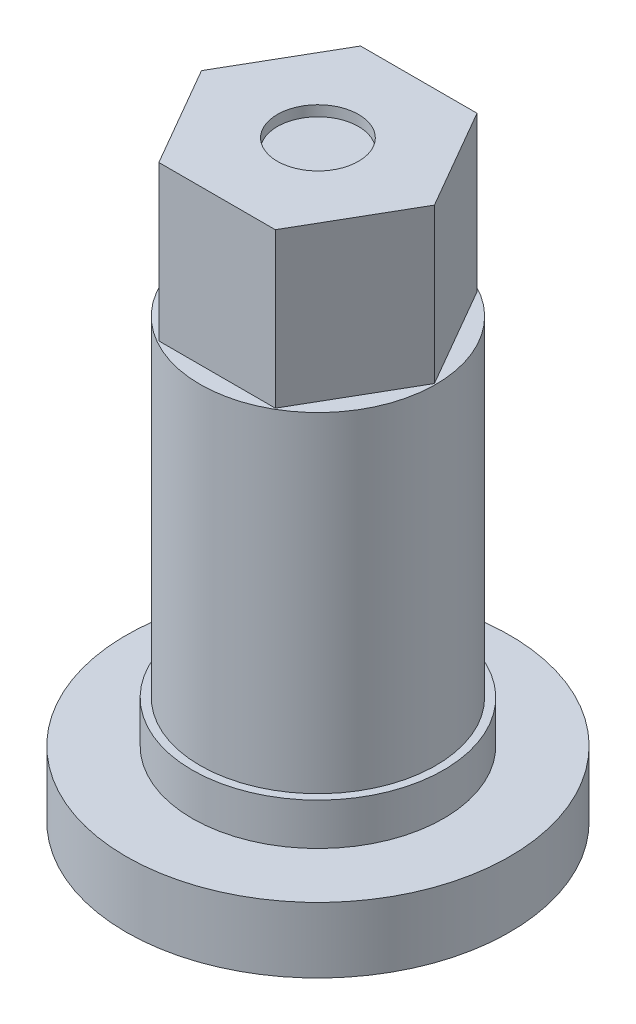
ISO-10303-21;
HEADER;
FILE_DESCRIPTION(('STEP AP214'),'2;1');
FILE_NAME('part.step','',(''),(''),'','','');
FILE_SCHEMA(('AUTOMOTIVE_DESIGN { 1 0 10303 214 1 1 1 1 }'));
ENDSEC;
DATA;
#1=APPLICATION_CONTEXT('core data for automotive mechanical design processes');
#2=APPLICATION_PROTOCOL_DEFINITION('international standard','automotive_design',2000,#1);
#3=PRODUCT_CONTEXT('',#1,'mechanical');
#4=PRODUCT('Part','Part','',(#3));
#5=PRODUCT_RELATED_PRODUCT_CATEGORY('part','',(#4));
#6=PRODUCT_DEFINITION_FORMATION('','',#4);
#7=PRODUCT_DEFINITION_CONTEXT('part definition',#1,'design');
#8=PRODUCT_DEFINITION('design','',#6,#7);
#9=PRODUCT_DEFINITION_SHAPE('','',#8);
#10=(LENGTH_UNIT() NAMED_UNIT(*) SI_UNIT(.MILLI.,.METRE.));
#11=(NAMED_UNIT(*) PLANE_ANGLE_UNIT() SI_UNIT($,.RADIAN.));
#12=(NAMED_UNIT(*) SI_UNIT($,.STERADIAN.) SOLID_ANGLE_UNIT());
#13=UNCERTAINTY_MEASURE_WITH_UNIT(LENGTH_MEASURE(1.E-05),#10,'distance_accuracy_value','');
#14=(GEOMETRIC_REPRESENTATION_CONTEXT(3) GLOBAL_UNCERTAINTY_ASSIGNED_CONTEXT((#13)) GLOBAL_UNIT_ASSIGNED_CONTEXT((#10,
#11,#12)) REPRESENTATION_CONTEXT('',''));
#15=CARTESIAN_POINT('',(0.,0.,0.));
#16=DIRECTION('',(0.,0.,1.));
#17=DIRECTION('',(1.,0.,0.));
#18=AXIS2_PLACEMENT_3D('',#15,#16,#17);
#19=CARTESIAN_POINT('',(0.,1.25,0.));
#20=DIRECTION('',(0.,-1.,0.));
#21=DIRECTION('',(0.,0.,-1.));
#22=AXIS2_PLACEMENT_3D('',#19,#20,#21);
#23=CYLINDRICAL_SURFACE('',#22,3.66);
#24=CARTESIAN_POINT('',(0.,1.25,0.));
#25=DIRECTION('',(0.,1.,0.));
#26=DIRECTION('',(0.,0.,1.));
#27=AXIS2_PLACEMENT_3D('',#24,#25,#26);
#28=CIRCLE('',#27,3.66);
#29=CARTESIAN_POINT('',(0.,1.25,3.66));
#30=VERTEX_POINT('',#29);
#31=EDGE_CURVE('E244',#30,#30,#28,.T.);
#32=ORIENTED_EDGE('',*,*,#31,.F.);
#33=EDGE_LOOP('',(#32));
#34=FACE_BOUND('',#33,.T.);
#35=CARTESIAN_POINT('',(0.,0.,0.));
#36=DIRECTION('',(0.,1.,0.));
#37=DIRECTION('',(0.,0.,1.));
#38=AXIS2_PLACEMENT_3D('',#35,#36,#37);
#39=CIRCLE('',#38,3.66);
#40=CARTESIAN_POINT('',(0.,0.,3.66));
#41=VERTEX_POINT('',#40);
#42=EDGE_CURVE('E44',#41,#41,#39,.T.);
#43=ORIENTED_EDGE('',*,*,#42,.T.);
#44=EDGE_LOOP('',(#43));
#45=FACE_BOUND('',#44,.T.);
#46=ADVANCED_FACE('F45',(#34,#45),#23,.T.);
#47=CARTESIAN_POINT('',(0.,1.25,0.));
#48=DIRECTION('',(0.,1.,0.));
#49=DIRECTION('',(0.,0.,1.));
#50=AXIS2_PLACEMENT_3D('',#47,#48,#49);
#51=PLANE('',#50);
#52=CARTESIAN_POINT('',(0.,1.25,0.));
#53=DIRECTION('',(0.,1.,0.));
#54=DIRECTION('',(0.,0.,1.));
#55=AXIS2_PLACEMENT_3D('',#52,#53,#54);
#56=CIRCLE('',#55,2.4);
#57=CARTESIAN_POINT('',(0.,1.25,2.4));
#58=VERTEX_POINT('',#57);
#59=EDGE_CURVE('E49',#58,#58,#56,.T.);
#60=ORIENTED_EDGE('',*,*,#59,.F.);
#61=EDGE_LOOP('',(#60));
#62=FACE_BOUND('',#61,.T.);
#63=ORIENTED_EDGE('',*,*,#31,.T.);
#64=EDGE_LOOP('',(#63));
#65=FACE_BOUND('',#64,.T.);
#66=ADVANCED_FACE('F257',(#62,#65),#51,.T.);
#67=CARTESIAN_POINT('',(0.,0.,0.));
#68=DIRECTION('',(0.,1.,0.));
#69=DIRECTION('',(0.,0.,1.));
#70=AXIS2_PLACEMENT_3D('',#67,#68,#69);
#71=PLANE('',#70);
#72=DIRECTION('',(0.5,0.,-0.866025403784439));
#73=VECTOR('',#72,1.);
#74=CARTESIAN_POINT('',(-0.95,0.,0.));
#75=LINE('',#74,#73);
#76=CARTESIAN_POINT('',(-0.95,0.,0.));
#77=VERTEX_POINT('',#76);
#78=CARTESIAN_POINT('',(-0.474999999999999,0.,-0.822724133595217));
#79=VERTEX_POINT('',#78);
#80=EDGE_CURVE('E170',#77,#79,#75,.T.);
#81=ORIENTED_EDGE('',*,*,#80,.F.);
#82=DIRECTION('',(-0.500000000000001,0.,-0.866025403784438));
#83=VECTOR('',#82,1.);
#84=CARTESIAN_POINT('',(-0.474999999999999,0.,0.822724133595217));
#85=LINE('',#84,#83);
#86=CARTESIAN_POINT('',(-0.474999999999999,0.,0.822724133595217));
#87=VERTEX_POINT('',#86);
#88=EDGE_CURVE('E59',#87,#77,#85,.T.);
#89=ORIENTED_EDGE('',*,*,#88,.F.);
#90=DIRECTION('',(-1.,0.,0.));
#91=VECTOR('',#90,1.);
#92=CARTESIAN_POINT('',(0.475000000000002,0.,0.822724133595216));
#93=LINE('',#92,#91);
#94=CARTESIAN_POINT('',(0.475000000000002,0.,0.822724133595216));
#95=VERTEX_POINT('',#94);
#96=EDGE_CURVE('E152',#95,#87,#93,.T.);
#97=ORIENTED_EDGE('',*,*,#96,.F.);
#98=DIRECTION('',(-0.499999999999999,0.,0.866025403784439));
#99=VECTOR('',#98,1.);
#100=CARTESIAN_POINT('',(0.95,0.,0.));
#101=LINE('',#100,#99);
#102=CARTESIAN_POINT('',(0.95,0.,0.));
#103=VERTEX_POINT('',#102);
#104=EDGE_CURVE('E156',#103,#95,#101,.T.);
#105=ORIENTED_EDGE('',*,*,#104,.F.);
#106=DIRECTION('',(0.500000000000001,0.,0.866025403784438));
#107=VECTOR('',#106,1.);
#108=CARTESIAN_POINT('',(0.474999999999999,0.,-0.822724133595218));
#109=LINE('',#108,#107);
#110=CARTESIAN_POINT('',(0.474999999999999,0.,-0.822724133595218));
#111=VERTEX_POINT('',#110);
#112=EDGE_CURVE('E175',#111,#103,#109,.T.);
#113=ORIENTED_EDGE('',*,*,#112,.F.);
#114=DIRECTION('',(1.,0.,0.));
#115=VECTOR('',#114,1.);
#116=CARTESIAN_POINT('',(-0.474999999999999,0.,-0.822724133595217));
#117=LINE('',#116,#115);
#118=EDGE_CURVE('E169',#79,#111,#117,.T.);
#119=ORIENTED_EDGE('',*,*,#118,.F.);
#120=EDGE_LOOP('',(#81,#89,#97,#105,#113,#119));
#121=FACE_BOUND('',#120,.T.);
#122=ORIENTED_EDGE('',*,*,#42,.F.);
#123=EDGE_LOOP('',(#122));
#124=FACE_BOUND('',#123,.T.);
#125=ADVANCED_FACE('F254',(#121,#124),#71,.F.);
#126=CARTESIAN_POINT('',(0.,2.05,0.));
#127=DIRECTION('',(0.,-1.,0.));
#128=DIRECTION('',(0.,0.,-1.));
#129=AXIS2_PLACEMENT_3D('',#126,#127,#128);
#130=CYLINDRICAL_SURFACE('',#129,2.4);
#131=CARTESIAN_POINT('',(0.,2.05,0.));
#132=DIRECTION('',(0.,1.,0.));
#133=DIRECTION('',(0.,0.,1.));
#134=AXIS2_PLACEMENT_3D('',#131,#132,#133);
#135=CIRCLE('',#134,2.4);
#136=CARTESIAN_POINT('',(0.,2.05,2.4));
#137=VERTEX_POINT('',#136);
#138=EDGE_CURVE('E239',#137,#137,#135,.T.);
#139=ORIENTED_EDGE('',*,*,#138,.F.);
#140=EDGE_LOOP('',(#139));
#141=FACE_BOUND('',#140,.T.);
#142=ORIENTED_EDGE('',*,*,#59,.T.);
#143=EDGE_LOOP('',(#142));
#144=FACE_BOUND('',#143,.T.);
#145=ADVANCED_FACE('F253',(#141,#144),#130,.T.);
#146=CARTESIAN_POINT('',(0.,2.05,0.));
#147=DIRECTION('',(0.,1.,0.));
#148=DIRECTION('',(0.,0.,1.));
#149=AXIS2_PLACEMENT_3D('',#146,#147,#148);
#150=PLANE('',#149);
#151=CARTESIAN_POINT('',(0.,2.05,0.));
#152=DIRECTION('',(0.,1.,0.));
#153=DIRECTION('',(0.,0.,1.));
#154=AXIS2_PLACEMENT_3D('',#151,#152,#153);
#155=CIRCLE('',#154,2.25);
#156=CARTESIAN_POINT('',(0.,2.05,2.25));
#157=VERTEX_POINT('',#156);
#158=EDGE_CURVE('E11',#157,#157,#155,.T.);
#159=ORIENTED_EDGE('',*,*,#158,.F.);
#160=EDGE_LOOP('',(#159));
#161=FACE_BOUND('',#160,.T.);
#162=ORIENTED_EDGE('',*,*,#138,.T.);
#163=EDGE_LOOP('',(#162));
#164=FACE_BOUND('',#163,.T.);
#165=ADVANCED_FACE('F262',(#161,#164),#150,.T.);
#166=CARTESIAN_POINT('',(0.,8.35,0.));
#167=DIRECTION('',(0.,-1.,0.));
#168=DIRECTION('',(0.,0.,-1.));
#169=AXIS2_PLACEMENT_3D('',#166,#167,#168);
#170=CYLINDRICAL_SURFACE('',#169,2.25);
#171=CARTESIAN_POINT('',(0.,8.35,0.));
#172=DIRECTION('',(0.,1.,0.));
#173=DIRECTION('',(0.,0.,1.));
#174=AXIS2_PLACEMENT_3D('',#171,#172,#173);
#175=CIRCLE('',#174,2.25);
#176=CARTESIAN_POINT('',(0.,8.35,2.25));
#177=VERTEX_POINT('',#176);
#178=EDGE_CURVE('E238',#177,#177,#175,.T.);
#179=ORIENTED_EDGE('',*,*,#178,.F.);
#180=EDGE_LOOP('',(#179));
#181=FACE_BOUND('',#180,.T.);
#182=ORIENTED_EDGE('',*,*,#158,.T.);
#183=EDGE_LOOP('',(#182));
#184=FACE_BOUND('',#183,.T.);
#185=ADVANCED_FACE('F289',(#181,#184),#170,.T.);
#186=CARTESIAN_POINT('',(0.,8.35,0.));
#187=DIRECTION('',(0.,1.,0.));
#188=DIRECTION('',(0.,0.,1.));
#189=AXIS2_PLACEMENT_3D('',#186,#187,#188);
#190=PLANE('',#189);
#191=DIRECTION('',(-0.5,0.,0.866025403784439));
#192=VECTOR('',#191,1.);
#193=CARTESIAN_POINT('',(-1.11139926819003,8.35,-1.925));
#194=LINE('',#193,#192);
#195=CARTESIAN_POINT('',(-1.11139926819003,8.35,-1.925));
#196=VERTEX_POINT('',#195);
#197=CARTESIAN_POINT('',(-2.22279853638006,8.35,0.));
#198=VERTEX_POINT('',#197);
#199=EDGE_CURVE('E68',#196,#198,#194,.T.);
#200=ORIENTED_EDGE('',*,*,#199,.F.);
#201=DIRECTION('',(-1.,0.,0.));
#202=VECTOR('',#201,1.);
#203=CARTESIAN_POINT('',(1.11139926819003,8.35,-1.925));
#204=LINE('',#203,#202);
#205=CARTESIAN_POINT('',(1.11139926819003,8.35,-1.925));
#206=VERTEX_POINT('',#205);
#207=EDGE_CURVE('E198',#206,#196,#204,.T.);
#208=ORIENTED_EDGE('',*,*,#207,.F.);
#209=DIRECTION('',(-0.5,0.,-0.866025403784438));
#210=VECTOR('',#209,1.);
#211=CARTESIAN_POINT('',(2.22279853638006,8.35,0.));
#212=LINE('',#211,#210);
#213=CARTESIAN_POINT('',(2.22279853638006,8.35,0.));
#214=VERTEX_POINT('',#213);
#215=EDGE_CURVE('E219',#214,#206,#212,.T.);
#216=ORIENTED_EDGE('',*,*,#215,.F.);
#217=DIRECTION('',(0.5,0.,-0.866025403784439));
#218=VECTOR('',#217,1.);
#219=CARTESIAN_POINT('',(1.11139926819003,8.35,1.925));
#220=LINE('',#219,#218);
#221=CARTESIAN_POINT('',(1.11139926819003,8.35,1.925));
#222=VERTEX_POINT('',#221);
#223=EDGE_CURVE('E211',#222,#214,#220,.T.);
#224=ORIENTED_EDGE('',*,*,#223,.F.);
#225=DIRECTION('',(1.,0.,0.));
#226=VECTOR('',#225,1.);
#227=CARTESIAN_POINT('',(-1.11139926819003,8.35,1.925));
#228=LINE('',#227,#226);
#229=CARTESIAN_POINT('',(-1.11139926819003,8.35,1.925));
#230=VERTEX_POINT('',#229);
#231=EDGE_CURVE('E212',#230,#222,#228,.T.);
#232=ORIENTED_EDGE('',*,*,#231,.F.);
#233=DIRECTION('',(0.5,0.,0.866025403784439));
#234=VECTOR('',#233,1.);
#235=CARTESIAN_POINT('',(-2.22279853638006,8.35,0.));
#236=LINE('',#235,#234);
#237=EDGE_CURVE('E206',#198,#230,#236,.T.);
#238=ORIENTED_EDGE('',*,*,#237,.F.);
#239=EDGE_LOOP('',(#200,#208,#216,#224,#232,#238));
#240=FACE_BOUND('',#239,.T.);
#241=ORIENTED_EDGE('',*,*,#178,.T.);
#242=EDGE_LOOP('',(#241));
#243=FACE_BOUND('',#242,.T.);
#244=ADVANCED_FACE('F299',(#240,#243),#190,.T.);
#245=CARTESIAN_POINT('',(-1.11139926819003,11.3,-1.925));
#246=DIRECTION('',(0.866025403784439,0.,0.5));
#247=DIRECTION('',(0.5,0.,-0.866025403784439));
#248=AXIS2_PLACEMENT_3D('',#245,#246,#247);
#249=PLANE('',#248);
#250=ORIENTED_EDGE('',*,*,#199,.T.);
#251=DIRECTION('',(0.,-1.,0.));
#252=VECTOR('',#251,1.);
#253=CARTESIAN_POINT('',(-2.22279853638006,11.3,0.));
#254=LINE('',#253,#252);
#255=CARTESIAN_POINT('',(-2.22279853638006,11.3,0.));
#256=VERTEX_POINT('',#255);
#257=EDGE_CURVE('E232',#256,#198,#254,.T.);
#258=ORIENTED_EDGE('',*,*,#257,.F.);
#259=DIRECTION('',(-0.5,0.,0.866025403784439));
#260=VECTOR('',#259,1.);
#261=CARTESIAN_POINT('',(-1.11139926819003,11.3,-1.925));
#262=LINE('',#261,#260);
#263=CARTESIAN_POINT('',(-1.11139926819003,11.3,-1.925));
#264=VERTEX_POINT('',#263);
#265=EDGE_CURVE('E195',#264,#256,#262,.T.);
#266=ORIENTED_EDGE('',*,*,#265,.F.);
#267=DIRECTION('',(0.,-1.,0.));
#268=VECTOR('',#267,1.);
#269=CARTESIAN_POINT('',(-1.11139926819003,11.3,-1.925));
#270=LINE('',#269,#268);
#271=EDGE_CURVE('E207',#264,#196,#270,.T.);
#272=ORIENTED_EDGE('',*,*,#271,.T.);
#273=EDGE_LOOP('',(#250,#258,#266,#272));
#274=FACE_BOUND('',#273,.T.);
#275=ADVANCED_FACE('F308',(#274),#249,.F.);
#276=CARTESIAN_POINT('',(-2.22279853638006,11.3,0.));
#277=DIRECTION('',(0.866025403784439,0.,-0.5));
#278=DIRECTION('',(-0.5,0.,-0.866025403784439));
#279=AXIS2_PLACEMENT_3D('',#276,#277,#278);
#280=PLANE('',#279);
#281=ORIENTED_EDGE('',*,*,#237,.T.);
#282=DIRECTION('',(0.,-1.,0.));
#283=VECTOR('',#282,1.);
#284=CARTESIAN_POINT('',(-1.11139926819003,11.3,1.925));
#285=LINE('',#284,#283);
#286=CARTESIAN_POINT('',(-1.11139926819003,11.3,1.925));
#287=VERTEX_POINT('',#286);
#288=EDGE_CURVE('E235',#287,#230,#285,.T.);
#289=ORIENTED_EDGE('',*,*,#288,.F.);
#290=DIRECTION('',(0.5,0.,0.866025403784439));
#291=VECTOR('',#290,1.);
#292=CARTESIAN_POINT('',(-2.22279853638006,11.3,0.));
#293=LINE('',#292,#291);
#294=EDGE_CURVE('E193',#256,#287,#293,.T.);
#295=ORIENTED_EDGE('',*,*,#294,.F.);
#296=ORIENTED_EDGE('',*,*,#257,.T.);
#297=EDGE_LOOP('',(#281,#289,#295,#296));
#298=FACE_BOUND('',#297,.T.);
#299=ADVANCED_FACE('F317',(#298),#280,.F.);
#300=CARTESIAN_POINT('',(-1.11139926819003,11.3,1.925));
#301=DIRECTION('',(0.,0.,-1.));
#302=DIRECTION('',(-1.,0.,0.));
#303=AXIS2_PLACEMENT_3D('',#300,#301,#302);
#304=PLANE('',#303);
#305=ORIENTED_EDGE('',*,*,#231,.T.);
#306=DIRECTION('',(0.,-1.,0.));
#307=VECTOR('',#306,1.);
#308=CARTESIAN_POINT('',(1.11139926819003,11.3,1.925));
#309=LINE('',#308,#307);
#310=CARTESIAN_POINT('',(1.11139926819003,11.3,1.925));
#311=VERTEX_POINT('',#310);
#312=EDGE_CURVE('E230',#311,#222,#309,.T.);
#313=ORIENTED_EDGE('',*,*,#312,.F.);
#314=DIRECTION('',(1.,0.,0.));
#315=VECTOR('',#314,1.);
#316=CARTESIAN_POINT('',(-1.11139926819003,11.3,1.925));
#317=LINE('',#316,#315);
#318=EDGE_CURVE('E197',#287,#311,#317,.T.);
#319=ORIENTED_EDGE('',*,*,#318,.F.);
#320=ORIENTED_EDGE('',*,*,#288,.T.);
#321=EDGE_LOOP('',(#305,#313,#319,#320));
#322=FACE_BOUND('',#321,.T.);
#323=ADVANCED_FACE('F323',(#322),#304,.F.);
#324=CARTESIAN_POINT('',(1.11139926819003,11.3,1.925));
#325=DIRECTION('',(-0.866025403784439,0.,-0.5));
#326=DIRECTION('',(-0.5,0.,0.866025403784439));
#327=AXIS2_PLACEMENT_3D('',#324,#325,#326);
#328=PLANE('',#327);
#329=ORIENTED_EDGE('',*,*,#223,.T.);
#330=DIRECTION('',(0.,-1.,0.));
#331=VECTOR('',#330,1.);
#332=CARTESIAN_POINT('',(2.22279853638006,11.3,0.));
#333=LINE('',#332,#331);
#334=CARTESIAN_POINT('',(2.22279853638006,11.3,0.));
#335=VERTEX_POINT('',#334);
#336=EDGE_CURVE('E228',#335,#214,#333,.T.);
#337=ORIENTED_EDGE('',*,*,#336,.F.);
#338=DIRECTION('',(0.5,0.,-0.866025403784439));
#339=VECTOR('',#338,1.);
#340=CARTESIAN_POINT('',(1.11139926819003,11.3,1.925));
#341=LINE('',#340,#339);
#342=EDGE_CURVE('E196',#311,#335,#341,.T.);
#343=ORIENTED_EDGE('',*,*,#342,.F.);
#344=ORIENTED_EDGE('',*,*,#312,.T.);
#345=EDGE_LOOP('',(#329,#337,#343,#344));
#346=FACE_BOUND('',#345,.T.);
#347=ADVANCED_FACE('F333',(#346),#328,.F.);
#348=CARTESIAN_POINT('',(2.22279853638006,11.3,0.));
#349=DIRECTION('',(-0.866025403784439,0.,0.5));
#350=DIRECTION('',(0.5,0.,0.866025403784438));
#351=AXIS2_PLACEMENT_3D('',#348,#349,#350);
#352=PLANE('',#351);
#353=ORIENTED_EDGE('',*,*,#215,.T.);
#354=DIRECTION('',(0.,-1.,0.));
#355=VECTOR('',#354,1.);
#356=CARTESIAN_POINT('',(1.11139926819003,11.3,-1.925));
#357=LINE('',#356,#355);
#358=CARTESIAN_POINT('',(1.11139926819003,11.3,-1.925));
#359=VERTEX_POINT('',#358);
#360=EDGE_CURVE('E222',#359,#206,#357,.T.);
#361=ORIENTED_EDGE('',*,*,#360,.F.);
#362=DIRECTION('',(-0.5,0.,-0.866025403784438));
#363=VECTOR('',#362,1.);
#364=CARTESIAN_POINT('',(2.22279853638006,11.3,0.));
#365=LINE('',#364,#363);
#366=EDGE_CURVE('E205',#335,#359,#365,.T.);
#367=ORIENTED_EDGE('',*,*,#366,.F.);
#368=ORIENTED_EDGE('',*,*,#336,.T.);
#369=EDGE_LOOP('',(#353,#361,#367,#368));
#370=FACE_BOUND('',#369,.T.);
#371=ADVANCED_FACE('F344',(#370),#352,.F.);
#372=CARTESIAN_POINT('',(1.11139926819003,11.3,-1.925));
#373=DIRECTION('',(0.,0.,1.));
#374=DIRECTION('',(1.,0.,0.));
#375=AXIS2_PLACEMENT_3D('',#372,#373,#374);
#376=PLANE('',#375);
#377=ORIENTED_EDGE('',*,*,#207,.T.);
#378=ORIENTED_EDGE('',*,*,#271,.F.);
#379=DIRECTION('',(-1.,0.,0.));
#380=VECTOR('',#379,1.);
#381=CARTESIAN_POINT('',(1.11139926819003,11.3,-1.925));
#382=LINE('',#381,#380);
#383=EDGE_CURVE('E203',#359,#264,#382,.T.);
#384=ORIENTED_EDGE('',*,*,#383,.F.);
#385=ORIENTED_EDGE('',*,*,#360,.T.);
#386=EDGE_LOOP('',(#377,#378,#384,#385));
#387=FACE_BOUND('',#386,.T.);
#388=ADVANCED_FACE('F355',(#387),#376,.F.);
#389=CARTESIAN_POINT('',(0.,11.3,0.));
#390=DIRECTION('',(0.,1.,0.));
#391=DIRECTION('',(0.,0.,1.));
#392=AXIS2_PLACEMENT_3D('',#389,#390,#391);
#393=PLANE('',#392);
#394=CARTESIAN_POINT('',(0.,11.3,0.));
#395=DIRECTION('',(0.,1.,0.));
#396=DIRECTION('',(0.,0.,1.));
#397=AXIS2_PLACEMENT_3D('',#394,#395,#396);
#398=CIRCLE('',#397,0.775);
#399=CARTESIAN_POINT('',(0.,11.3,0.775));
#400=VERTEX_POINT('',#399);
#401=EDGE_CURVE('E177',#400,#400,#398,.T.);
#402=ORIENTED_EDGE('',*,*,#401,.F.);
#403=EDGE_LOOP('',(#402));
#404=FACE_BOUND('',#403,.T.);
#405=ORIENTED_EDGE('',*,*,#265,.T.);
#406=ORIENTED_EDGE('',*,*,#294,.T.);
#407=ORIENTED_EDGE('',*,*,#318,.T.);
#408=ORIENTED_EDGE('',*,*,#342,.T.);
#409=ORIENTED_EDGE('',*,*,#366,.T.);
#410=ORIENTED_EDGE('',*,*,#383,.T.);
#411=EDGE_LOOP('',(#405,#406,#407,#408,#409,#410));
#412=FACE_BOUND('',#411,.T.);
#413=ADVANCED_FACE('F363',(#404,#412),#393,.T.);
#414=CARTESIAN_POINT('',(0.,11.1,0.));
#415=DIRECTION('',(0.,1.,0.));
#416=DIRECTION('',(0.,0.,1.));
#417=AXIS2_PLACEMENT_3D('',#414,#415,#416);
#418=CYLINDRICAL_SURFACE('',#417,0.775);
#419=CARTESIAN_POINT('',(0.,11.1,0.));
#420=DIRECTION('',(0.,1.,0.));
#421=DIRECTION('',(0.,0.,1.));
#422=AXIS2_PLACEMENT_3D('',#419,#420,#421);
#423=CIRCLE('',#422,0.775);
#424=CARTESIAN_POINT('',(0.,11.1,0.775));
#425=VERTEX_POINT('',#424);
#426=EDGE_CURVE('E190',#425,#425,#423,.T.);
#427=ORIENTED_EDGE('',*,*,#426,.F.);
#428=EDGE_LOOP('',(#427));
#429=FACE_BOUND('',#428,.T.);
#430=ORIENTED_EDGE('',*,*,#401,.T.);
#431=EDGE_LOOP('',(#430));
#432=FACE_BOUND('',#431,.T.);
#433=ADVANCED_FACE('F369',(#429,#432),#418,.F.);
#434=CARTESIAN_POINT('',(0.,11.1,0.));
#435=DIRECTION('',(0.,1.,0.));
#436=DIRECTION('',(0.,0.,1.));
#437=AXIS2_PLACEMENT_3D('',#434,#435,#436);
#438=PLANE('',#437);
#439=ORIENTED_EDGE('',*,*,#426,.T.);
#440=EDGE_LOOP('',(#439));
#441=FACE_BOUND('',#440,.T.);
#442=ADVANCED_FACE('F377',(#441),#438,.T.);
#443=CARTESIAN_POINT('',(-0.474999999999999,10.77,0.822724133595217));
#444=DIRECTION('',(-0.866025403784438,0.,0.500000000000001));
#445=DIRECTION('',(0.500000000000001,0.,0.866025403784438));
#446=AXIS2_PLACEMENT_3D('',#443,#444,#445);
#447=PLANE('',#446);
#448=ORIENTED_EDGE('',*,*,#88,.T.);
#449=DIRECTION('',(0.,-1.,0.));
#450=VECTOR('',#449,1.);
#451=CARTESIAN_POINT('',(-0.95,10.77,0.));
#452=LINE('',#451,#450);
#453=CARTESIAN_POINT('',(-0.95,10.77,0.));
#454=VERTEX_POINT('',#453);
#455=EDGE_CURVE('E128',#454,#77,#452,.T.);
#456=ORIENTED_EDGE('',*,*,#455,.F.);
#457=DIRECTION('',(-0.500000000000001,0.,-0.866025403784438));
#458=VECTOR('',#457,1.);
#459=CARTESIAN_POINT('',(-0.474999999999999,10.77,0.822724133595217));
#460=LINE('',#459,#458);
#461=CARTESIAN_POINT('',(-0.474999999999999,10.77,0.822724133595217));
#462=VERTEX_POINT('',#461);
#463=EDGE_CURVE('E135',#462,#454,#460,.T.);
#464=ORIENTED_EDGE('',*,*,#463,.F.);
#465=DIRECTION('',(0.,-1.,0.));
#466=VECTOR('',#465,1.);
#467=CARTESIAN_POINT('',(-0.474999999999999,10.77,0.822724133595217));
#468=LINE('',#467,#466);
#469=EDGE_CURVE('E180',#462,#87,#468,.T.);
#470=ORIENTED_EDGE('',*,*,#469,.T.);
#471=EDGE_LOOP('',(#448,#456,#464,#470));
#472=FACE_BOUND('',#471,.T.);
#473=ADVANCED_FACE('F134',(#472),#447,.F.);
#474=CARTESIAN_POINT('',(0.475000000000002,10.77,0.822724133595216));
#475=DIRECTION('',(0.,0.,1.));
#476=DIRECTION('',(1.,0.,0.));
#477=AXIS2_PLACEMENT_3D('',#474,#475,#476);
#478=PLANE('',#477);
#479=ORIENTED_EDGE('',*,*,#96,.T.);
#480=ORIENTED_EDGE('',*,*,#469,.F.);
#481=DIRECTION('',(-1.,0.,0.));
#482=VECTOR('',#481,1.);
#483=CARTESIAN_POINT('',(0.475000000000002,10.77,0.822724133595216));
#484=LINE('',#483,#482);
#485=CARTESIAN_POINT('',(0.475000000000002,10.77,0.822724133595216));
#486=VERTEX_POINT('',#485);
#487=EDGE_CURVE('E139',#486,#462,#484,.T.);
#488=ORIENTED_EDGE('',*,*,#487,.F.);
#489=DIRECTION('',(0.,-1.,0.));
#490=VECTOR('',#489,1.);
#491=CARTESIAN_POINT('',(0.475000000000002,10.77,0.822724133595216));
#492=LINE('',#491,#490);
#493=EDGE_CURVE('E179',#486,#95,#492,.T.);
#494=ORIENTED_EDGE('',*,*,#493,.T.);
#495=EDGE_LOOP('',(#479,#480,#488,#494));
#496=FACE_BOUND('',#495,.T.);
#497=ADVANCED_FACE('F400',(#496),#478,.F.);
#498=CARTESIAN_POINT('',(0.95,10.77,0.));
#499=DIRECTION('',(0.866025403784439,0.,0.499999999999999));
#500=DIRECTION('',(0.499999999999999,0.,-0.866025403784439));
#501=AXIS2_PLACEMENT_3D('',#498,#499,#500);
#502=PLANE('',#501);
#503=ORIENTED_EDGE('',*,*,#104,.T.);
#504=ORIENTED_EDGE('',*,*,#493,.F.);
#505=DIRECTION('',(-0.499999999999999,0.,0.866025403784439));
#506=VECTOR('',#505,1.);
#507=CARTESIAN_POINT('',(0.95,10.77,0.));
#508=LINE('',#507,#506);
#509=CARTESIAN_POINT('',(0.95,10.77,0.));
#510=VERTEX_POINT('',#509);
#511=EDGE_CURVE('E161',#510,#486,#508,.T.);
#512=ORIENTED_EDGE('',*,*,#511,.F.);
#513=DIRECTION('',(0.,-1.,0.));
#514=VECTOR('',#513,1.);
#515=CARTESIAN_POINT('',(0.95,10.77,0.));
#516=LINE('',#515,#514);
#517=EDGE_CURVE('E185',#510,#103,#516,.T.);
#518=ORIENTED_EDGE('',*,*,#517,.T.);
#519=EDGE_LOOP('',(#503,#504,#512,#518));
#520=FACE_BOUND('',#519,.T.);
#521=ADVANCED_FACE('F407',(#520),#502,.F.);
#522=CARTESIAN_POINT('',(0.474999999999999,10.77,-0.822724133595218));
#523=DIRECTION('',(0.866025403784438,0.,-0.500000000000001));
#524=DIRECTION('',(-0.500000000000001,0.,-0.866025403784438));
#525=AXIS2_PLACEMENT_3D('',#522,#523,#524);
#526=PLANE('',#525);
#527=ORIENTED_EDGE('',*,*,#112,.T.);
#528=ORIENTED_EDGE('',*,*,#517,.F.);
#529=DIRECTION('',(0.500000000000001,0.,0.866025403784438));
#530=VECTOR('',#529,1.);
#531=CARTESIAN_POINT('',(0.474999999999999,10.77,-0.822724133595218));
#532=LINE('',#531,#530);
#533=CARTESIAN_POINT('',(0.474999999999999,10.77,-0.822724133595218));
#534=VERTEX_POINT('',#533);
#535=EDGE_CURVE('E159',#534,#510,#532,.T.);
#536=ORIENTED_EDGE('',*,*,#535,.F.);
#537=DIRECTION('',(0.,-1.,0.));
#538=VECTOR('',#537,1.);
#539=CARTESIAN_POINT('',(0.474999999999999,10.77,-0.822724133595218));
#540=LINE('',#539,#538);
#541=EDGE_CURVE('E183',#534,#111,#540,.T.);
#542=ORIENTED_EDGE('',*,*,#541,.T.);
#543=EDGE_LOOP('',(#527,#528,#536,#542));
#544=FACE_BOUND('',#543,.T.);
#545=ADVANCED_FACE('F416',(#544),#526,.F.);
#546=CARTESIAN_POINT('',(-0.474999999999999,10.77,-0.822724133595217));
#547=DIRECTION('',(0.,0.,-1.));
#548=DIRECTION('',(-1.,0.,0.));
#549=AXIS2_PLACEMENT_3D('',#546,#547,#548);
#550=PLANE('',#549);
#551=ORIENTED_EDGE('',*,*,#118,.T.);
#552=ORIENTED_EDGE('',*,*,#541,.F.);
#553=DIRECTION('',(1.,0.,0.));
#554=VECTOR('',#553,1.);
#555=CARTESIAN_POINT('',(-0.474999999999999,10.77,-0.822724133595217));
#556=LINE('',#555,#554);
#557=CARTESIAN_POINT('',(-0.474999999999999,10.77,-0.822724133595217));
#558=VERTEX_POINT('',#557);
#559=EDGE_CURVE('E149',#558,#534,#556,.T.);
#560=ORIENTED_EDGE('',*,*,#559,.F.);
#561=DIRECTION('',(0.,-1.,0.));
#562=VECTOR('',#561,1.);
#563=CARTESIAN_POINT('',(-0.474999999999999,10.77,-0.822724133595217));
#564=LINE('',#563,#562);
#565=EDGE_CURVE('E138',#558,#79,#564,.T.);
#566=ORIENTED_EDGE('',*,*,#565,.T.);
#567=EDGE_LOOP('',(#551,#552,#560,#566));
#568=FACE_BOUND('',#567,.T.);
#569=ADVANCED_FACE('F428',(#568),#550,.F.);
#570=CARTESIAN_POINT('',(-0.95,10.77,0.));
#571=DIRECTION('',(-0.866025403784439,0.,-0.5));
#572=DIRECTION('',(-0.5,0.,0.866025403784439));
#573=AXIS2_PLACEMENT_3D('',#570,#571,#572);
#574=PLANE('',#573);
#575=ORIENTED_EDGE('',*,*,#80,.T.);
#576=ORIENTED_EDGE('',*,*,#565,.F.);
#577=DIRECTION('',(0.5,0.,-0.866025403784439));
#578=VECTOR('',#577,1.);
#579=CARTESIAN_POINT('',(-0.95,10.77,0.));
#580=LINE('',#579,#578);
#581=EDGE_CURVE('E141',#454,#558,#580,.T.);
#582=ORIENTED_EDGE('',*,*,#581,.F.);
#583=ORIENTED_EDGE('',*,*,#455,.T.);
#584=EDGE_LOOP('',(#575,#576,#582,#583));
#585=FACE_BOUND('',#584,.T.);
#586=ADVANCED_FACE('F144',(#585),#574,.F.);
#587=CARTESIAN_POINT('',(0.,10.77,0.));
#588=DIRECTION('',(0.,-1.,0.));
#589=DIRECTION('',(0.,0.,-1.));
#590=AXIS2_PLACEMENT_3D('',#587,#588,#589);
#591=PLANE('',#590);
#592=ORIENTED_EDGE('',*,*,#463,.T.);
#593=ORIENTED_EDGE('',*,*,#581,.T.);
#594=ORIENTED_EDGE('',*,*,#559,.T.);
#595=ORIENTED_EDGE('',*,*,#535,.T.);
#596=ORIENTED_EDGE('',*,*,#511,.T.);
#597=ORIENTED_EDGE('',*,*,#487,.T.);
#598=EDGE_LOOP('',(#592,#593,#594,#595,#596,#597));
#599=FACE_BOUND('',#598,.T.);
#600=ADVANCED_FACE('F148',(#599),#591,.T.);
#601=CLOSED_SHELL('',(#46,#66,#125,#145,#165,#185,#244,#275,#299,#323,#347,#371,#388,#413,#433,
#442,#473,#497,#521,#545,#569,#586,#600));
#602=MANIFOLD_SOLID_BREP('B2',#601);
#603=ADVANCED_BREP_SHAPE_REPRESENTATION('',(#18,#602),#14);
#604=SHAPE_DEFINITION_REPRESENTATION(#9,#603);
ENDSEC;
END-ISO-10303-21;
